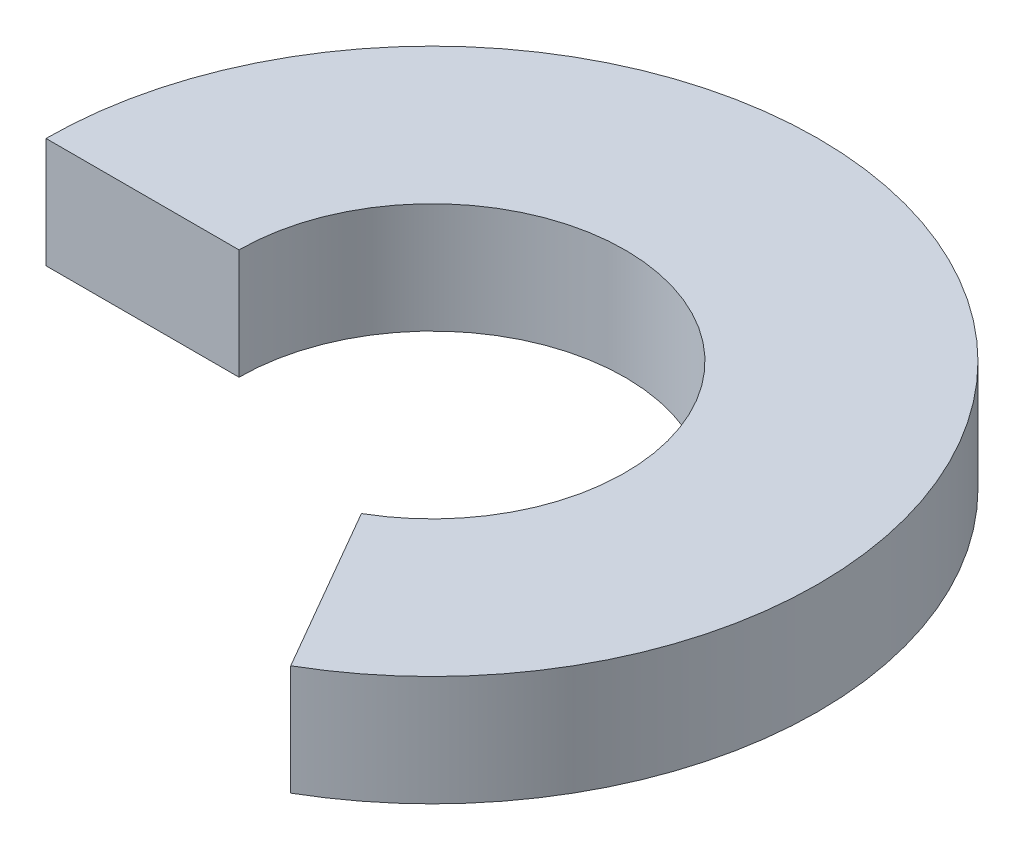
ISO-10303-21;
HEADER;
FILE_DESCRIPTION(('STEP AP214'),'2;1');
FILE_NAME('part.step','',(''),(''),'','','');
FILE_SCHEMA(('AUTOMOTIVE_DESIGN { 1 0 10303 214 1 1 1 1 }'));
ENDSEC;
DATA;
#1=APPLICATION_CONTEXT('core data for automotive mechanical design processes');
#2=APPLICATION_PROTOCOL_DEFINITION('international standard','automotive_design',2000,#1);
#3=PRODUCT_CONTEXT('',#1,'mechanical');
#4=PRODUCT('Part','Part','',(#3));
#5=PRODUCT_RELATED_PRODUCT_CATEGORY('part','',(#4));
#6=PRODUCT_DEFINITION_FORMATION('','',#4);
#7=PRODUCT_DEFINITION_CONTEXT('part definition',#1,'design');
#8=PRODUCT_DEFINITION('design','',#6,#7);
#9=PRODUCT_DEFINITION_SHAPE('','',#8);
#10=(LENGTH_UNIT() NAMED_UNIT(*) SI_UNIT(.MILLI.,.METRE.));
#11=(NAMED_UNIT(*) PLANE_ANGLE_UNIT() SI_UNIT($,.RADIAN.));
#12=(NAMED_UNIT(*) SI_UNIT($,.STERADIAN.) SOLID_ANGLE_UNIT());
#13=UNCERTAINTY_MEASURE_WITH_UNIT(LENGTH_MEASURE(1.E-05),#10,'distance_accuracy_value','');
#14=(GEOMETRIC_REPRESENTATION_CONTEXT(3) GLOBAL_UNCERTAINTY_ASSIGNED_CONTEXT((#13)) GLOBAL_UNIT_ASSIGNED_CONTEXT((#10,
#11,#12)) REPRESENTATION_CONTEXT('',''));
#15=CARTESIAN_POINT('',(0.,0.,0.));
#16=DIRECTION('',(0.,0.,1.));
#17=DIRECTION('',(1.,0.,0.));
#18=AXIS2_PLACEMENT_3D('',#15,#16,#17);
#19=CARTESIAN_POINT('',(0.,2.,0.));
#20=DIRECTION('',(0.,-1.,0.));
#21=DIRECTION('',(0.,0.,-1.));
#22=AXIS2_PLACEMENT_3D('',#19,#20,#21);
#23=CYLINDRICAL_SURFACE('',#22,3.5);
#24=CARTESIAN_POINT('',(0.,0.,0.));
#25=DIRECTION('',(0.,-1.,0.));
#26=DIRECTION('',(0.,0.,-1.));
#27=AXIS2_PLACEMENT_3D('',#24,#25,#26);
#28=CIRCLE('',#27,3.5);
#29=CARTESIAN_POINT('',(-3.5,0.,0.));
#30=VERTEX_POINT('',#29);
#31=CARTESIAN_POINT('',(1.74999999999999,0.,3.03108891324554));
#32=VERTEX_POINT('',#31);
#33=EDGE_CURVE('E102',#30,#32,#28,.T.);
#34=ORIENTED_EDGE('',*,*,#33,.T.);
#35=DIRECTION('',(0.,-1.,0.));
#36=VECTOR('',#35,1.);
#37=CARTESIAN_POINT('',(1.74999999999999,2.,3.03108891324554));
#38=LINE('',#37,#36);
#39=CARTESIAN_POINT('',(1.74999999999999,2.,3.03108891324554));
#40=VERTEX_POINT('',#39);
#41=EDGE_CURVE('E11',#40,#32,#38,.T.);
#42=ORIENTED_EDGE('',*,*,#41,.F.);
#43=CARTESIAN_POINT('',(0.,2.,0.));
#44=DIRECTION('',(0.,-1.,0.));
#45=DIRECTION('',(0.,0.,-1.));
#46=AXIS2_PLACEMENT_3D('',#43,#44,#45);
#47=CIRCLE('',#46,3.5);
#48=CARTESIAN_POINT('',(-3.5,2.,0.));
#49=VERTEX_POINT('',#48);
#50=EDGE_CURVE('E90',#49,#40,#47,.T.);
#51=ORIENTED_EDGE('',*,*,#50,.F.);
#52=DIRECTION('',(0.,-1.,0.));
#53=VECTOR('',#52,1.);
#54=CARTESIAN_POINT('',(-3.5,2.,0.));
#55=LINE('',#54,#53);
#56=EDGE_CURVE('E98',#49,#30,#55,.T.);
#57=ORIENTED_EDGE('',*,*,#56,.T.);
#58=EDGE_LOOP('',(#34,#42,#51,#57));
#59=FACE_BOUND('',#58,.T.);
#60=ADVANCED_FACE('F39',(#59),#23,.F.);
#61=CARTESIAN_POINT('',(1.74999999999999,2.,3.03108891324554));
#62=DIRECTION('',(0.86602540378444,0.,-0.499999999999997));
#63=DIRECTION('',(-0.499999999999997,0.,-0.86602540378444));
#64=AXIS2_PLACEMENT_3D('',#61,#62,#63);
#65=PLANE('',#64);
#66=DIRECTION('',(0.499999999999997,0.,0.86602540378444));
#67=VECTOR('',#66,1.);
#68=CARTESIAN_POINT('',(1.74999999999999,0.,3.03108891324554));
#69=LINE('',#68,#67);
#70=CARTESIAN_POINT('',(3.49999999999999,0.,6.06217782649108));
#71=VERTEX_POINT('',#70);
#72=EDGE_CURVE('E94',#32,#71,#69,.T.);
#73=ORIENTED_EDGE('',*,*,#72,.T.);
#74=DIRECTION('',(0.,-1.,0.));
#75=VECTOR('',#74,1.);
#76=CARTESIAN_POINT('',(3.49999999999999,2.,6.06217782649108));
#77=LINE('',#76,#75);
#78=CARTESIAN_POINT('',(3.49999999999999,2.,6.06217782649108));
#79=VERTEX_POINT('',#78);
#80=EDGE_CURVE('E47',#79,#71,#77,.T.);
#81=ORIENTED_EDGE('',*,*,#80,.F.);
#82=DIRECTION('',(0.499999999999997,0.,0.86602540378444));
#83=VECTOR('',#82,1.);
#84=CARTESIAN_POINT('',(1.74999999999999,2.,3.03108891324554));
#85=LINE('',#84,#83);
#86=EDGE_CURVE('E85',#40,#79,#85,.T.);
#87=ORIENTED_EDGE('',*,*,#86,.F.);
#88=ORIENTED_EDGE('',*,*,#41,.T.);
#89=EDGE_LOOP('',(#73,#81,#87,#88));
#90=FACE_BOUND('',#89,.T.);
#91=ADVANCED_FACE('F93',(#90),#65,.F.);
#92=CARTESIAN_POINT('',(0.,2.,0.));
#93=DIRECTION('',(0.,-1.,0.));
#94=DIRECTION('',(0.,0.,-1.));
#95=AXIS2_PLACEMENT_3D('',#92,#93,#94);
#96=CYLINDRICAL_SURFACE('',#95,7.);
#97=CARTESIAN_POINT('',(0.,0.,0.));
#98=DIRECTION('',(0.,1.,0.));
#99=DIRECTION('',(0.,0.,-1.));
#100=AXIS2_PLACEMENT_3D('',#97,#98,#99);
#101=CIRCLE('',#100,7.);
#102=CARTESIAN_POINT('',(-7.,0.,0.));
#103=VERTEX_POINT('',#102);
#104=EDGE_CURVE('E72',#71,#103,#101,.T.);
#105=ORIENTED_EDGE('',*,*,#104,.T.);
#106=DIRECTION('',(0.,-1.,0.));
#107=VECTOR('',#106,1.);
#108=CARTESIAN_POINT('',(-7.,2.,0.));
#109=LINE('',#108,#107);
#110=CARTESIAN_POINT('',(-7.,2.,0.));
#111=VERTEX_POINT('',#110);
#112=EDGE_CURVE('E95',#111,#103,#109,.T.);
#113=ORIENTED_EDGE('',*,*,#112,.F.);
#114=CARTESIAN_POINT('',(0.,2.,0.));
#115=DIRECTION('',(0.,1.,0.));
#116=DIRECTION('',(0.,0.,-1.));
#117=AXIS2_PLACEMENT_3D('',#114,#115,#116);
#118=CIRCLE('',#117,7.);
#119=EDGE_CURVE('E88',#79,#111,#118,.T.);
#120=ORIENTED_EDGE('',*,*,#119,.F.);
#121=ORIENTED_EDGE('',*,*,#80,.T.);
#122=EDGE_LOOP('',(#105,#113,#120,#121));
#123=FACE_BOUND('',#122,.T.);
#124=ADVANCED_FACE('F96',(#123),#96,.T.);
#125=CARTESIAN_POINT('',(-7.,2.,0.));
#126=DIRECTION('',(0.,0.,-1.));
#127=DIRECTION('',(-1.,0.,0.));
#128=AXIS2_PLACEMENT_3D('',#125,#126,#127);
#129=PLANE('',#128);
#130=DIRECTION('',(1.,0.,0.));
#131=VECTOR('',#130,1.);
#132=CARTESIAN_POINT('',(-7.,0.,0.));
#133=LINE('',#132,#131);
#134=EDGE_CURVE('E78',#103,#30,#133,.T.);
#135=ORIENTED_EDGE('',*,*,#134,.T.);
#136=ORIENTED_EDGE('',*,*,#56,.F.);
#137=DIRECTION('',(1.,0.,0.));
#138=VECTOR('',#137,1.);
#139=CARTESIAN_POINT('',(-7.,2.,0.));
#140=LINE('',#139,#138);
#141=EDGE_CURVE('E55',#111,#49,#140,.T.);
#142=ORIENTED_EDGE('',*,*,#141,.F.);
#143=ORIENTED_EDGE('',*,*,#112,.T.);
#144=EDGE_LOOP('',(#135,#136,#142,#143));
#145=FACE_BOUND('',#144,.T.);
#146=ADVANCED_FACE('F109',(#145),#129,.F.);
#147=CARTESIAN_POINT('',(0.,2.,0.));
#148=DIRECTION('',(0.,-1.,0.));
#149=DIRECTION('',(0.,0.,-1.));
#150=AXIS2_PLACEMENT_3D('',#147,#148,#149);
#151=PLANE('',#150);
#152=ORIENTED_EDGE('',*,*,#50,.T.);
#153=ORIENTED_EDGE('',*,*,#86,.T.);
#154=ORIENTED_EDGE('',*,*,#119,.T.);
#155=ORIENTED_EDGE('',*,*,#141,.T.);
#156=EDGE_LOOP('',(#152,#153,#154,#155));
#157=FACE_BOUND('',#156,.T.);
#158=ADVANCED_FACE('F86',(#157),#151,.F.);
#159=CARTESIAN_POINT('',(0.,0.,0.));
#160=DIRECTION('',(0.,-1.,0.));
#161=DIRECTION('',(0.,0.,-1.));
#162=AXIS2_PLACEMENT_3D('',#159,#160,#161);
#163=PLANE('',#162);
#164=ORIENTED_EDGE('',*,*,#33,.F.);
#165=ORIENTED_EDGE('',*,*,#134,.F.);
#166=ORIENTED_EDGE('',*,*,#104,.F.);
#167=ORIENTED_EDGE('',*,*,#72,.F.);
#168=EDGE_LOOP('',(#164,#165,#166,#167));
#169=FACE_BOUND('',#168,.T.);
#170=ADVANCED_FACE('F112',(#169),#163,.T.);
#171=CLOSED_SHELL('',(#60,#91,#124,#146,#158,#170));
#172=MANIFOLD_SOLID_BREP('B2',#171);
#173=ADVANCED_BREP_SHAPE_REPRESENTATION('',(#18,#172),#14);
#174=SHAPE_DEFINITION_REPRESENTATION(#9,#173);
ENDSEC;
END-ISO-10303-21;
